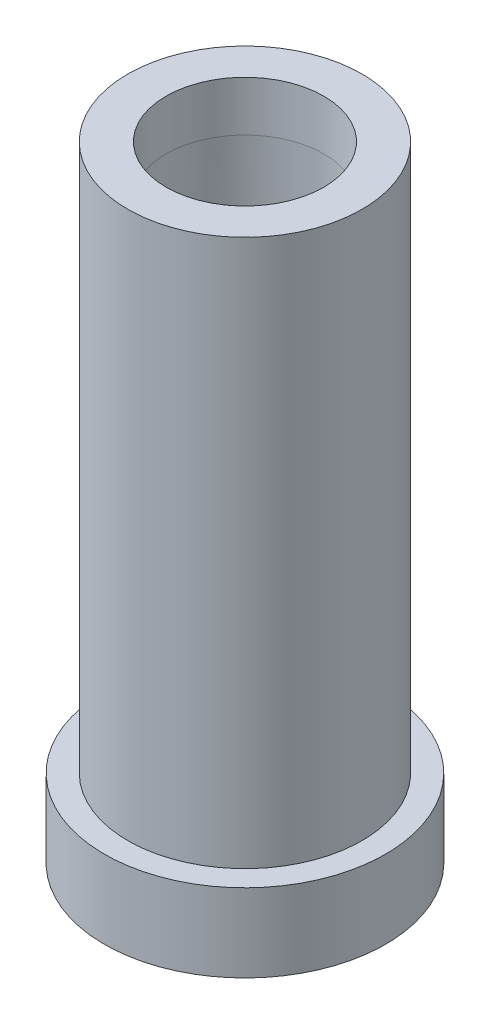
ISO-10303-21;
HEADER;
FILE_DESCRIPTION(('STEP AP214'),'2;1');
FILE_NAME('part.step','',(''),(''),'','','');
FILE_SCHEMA(('AUTOMOTIVE_DESIGN { 1 0 10303 214 1 1 1 1 }'));
ENDSEC;
DATA;
#1=APPLICATION_CONTEXT('core data for automotive mechanical design processes');
#2=APPLICATION_PROTOCOL_DEFINITION('international standard','automotive_design',2000,#1);
#3=PRODUCT_CONTEXT('',#1,'mechanical');
#4=PRODUCT('Part','Part','',(#3));
#5=PRODUCT_RELATED_PRODUCT_CATEGORY('part','',(#4));
#6=PRODUCT_DEFINITION_FORMATION('','',#4);
#7=PRODUCT_DEFINITION_CONTEXT('part definition',#1,'design');
#8=PRODUCT_DEFINITION('design','',#6,#7);
#9=PRODUCT_DEFINITION_SHAPE('','',#8);
#10=(LENGTH_UNIT() NAMED_UNIT(*) SI_UNIT(.MILLI.,.METRE.));
#11=(NAMED_UNIT(*) PLANE_ANGLE_UNIT() SI_UNIT($,.RADIAN.));
#12=(NAMED_UNIT(*) SI_UNIT($,.STERADIAN.) SOLID_ANGLE_UNIT());
#13=UNCERTAINTY_MEASURE_WITH_UNIT(LENGTH_MEASURE(1.E-05),#10,'distance_accuracy_value','');
#14=(GEOMETRIC_REPRESENTATION_CONTEXT(3) GLOBAL_UNCERTAINTY_ASSIGNED_CONTEXT((#13)) GLOBAL_UNIT_ASSIGNED_CONTEXT((#10,
#11,#12)) REPRESENTATION_CONTEXT('',''));
#15=CARTESIAN_POINT('',(0.,0.,0.));
#16=DIRECTION('',(0.,0.,1.));
#17=DIRECTION('',(1.,0.,0.));
#18=AXIS2_PLACEMENT_3D('',#15,#16,#17);
#19=CARTESIAN_POINT('',(0.,-0.001000000000001,0.));
#20=DIRECTION('',(0.,1.,0.));
#21=DIRECTION('',(0.,0.,1.));
#22=AXIS2_PLACEMENT_3D('',#19,#20,#21);
#23=CYLINDRICAL_SURFACE('',#22,5.05);
#24=CARTESIAN_POINT('',(0.,40.,0.));
#25=DIRECTION('',(0.,1.,0.));
#26=DIRECTION('',(0.,0.,1.));
#27=AXIS2_PLACEMENT_3D('',#24,#25,#26);
#28=CIRCLE('',#27,5.05);
#29=CARTESIAN_POINT('',(0.,40.,5.05));
#30=VERTEX_POINT('',#29);
#31=EDGE_CURVE('E63',#30,#30,#28,.T.);
#32=ORIENTED_EDGE('',*,*,#31,.T.);
#33=EDGE_LOOP('',(#32));
#34=FACE_BOUND('',#33,.T.);
#35=CARTESIAN_POINT('',(0.,36.8,0.));
#36=DIRECTION('',(0.,1.,0.));
#37=DIRECTION('',(1.,0.,0.));
#38=AXIS2_PLACEMENT_3D('',#35,#36,#37);
#39=CIRCLE('',#38,5.05);
#40=CARTESIAN_POINT('',(5.05,36.8,0.));
#41=VERTEX_POINT('',#40);
#42=EDGE_CURVE('E59',#41,#41,#39,.T.);
#43=ORIENTED_EDGE('',*,*,#42,.F.);
#44=EDGE_LOOP('',(#43));
#45=FACE_BOUND('',#44,.T.);
#46=ADVANCED_FACE('F41',(#34,#45),#23,.F.);
#47=CARTESIAN_POINT('',(0.,0.,0.));
#48=DIRECTION('',(0.,1.,0.));
#49=DIRECTION('',(-1.,0.,0.));
#50=AXIS2_PLACEMENT_3D('',#47,#48,#49);
#51=PLANE('',#50);
#52=CARTESIAN_POINT('',(0.,0.,0.));
#53=DIRECTION('',(0.,1.,0.));
#54=DIRECTION('',(1.,0.,0.));
#55=AXIS2_PLACEMENT_3D('',#52,#53,#54);
#56=CIRCLE('',#55,6.01364191374583);
#57=CARTESIAN_POINT('',(6.01364191374583,0.,0.));
#58=VERTEX_POINT('',#57);
#59=EDGE_CURVE('E56',#58,#58,#56,.T.);
#60=ORIENTED_EDGE('',*,*,#59,.T.);
#61=EDGE_LOOP('',(#60));
#62=FACE_BOUND('',#61,.T.);
#63=CARTESIAN_POINT('',(0.,0.,0.));
#64=DIRECTION('',(0.,1.,0.));
#65=DIRECTION('',(-1.,0.,0.));
#66=AXIS2_PLACEMENT_3D('',#63,#64,#65);
#67=CIRCLE('',#66,9.00000000000001);
#68=CARTESIAN_POINT('',(-9.00000000000001,0.,0.));
#69=VERTEX_POINT('',#68);
#70=EDGE_CURVE('E11',#69,#69,#67,.T.);
#71=ORIENTED_EDGE('',*,*,#70,.F.);
#72=EDGE_LOOP('',(#71));
#73=FACE_BOUND('',#72,.T.);
#74=ADVANCED_FACE('F43',(#62,#73),#51,.F.);
#75=CARTESIAN_POINT('',(0.,45.,0.));
#76=DIRECTION('',(0.,1.,0.));
#77=DIRECTION('',(-1.,0.,0.));
#78=AXIS2_PLACEMENT_3D('',#75,#76,#77);
#79=CYLINDRICAL_SURFACE('',#78,9.00000000000001);
#80=CARTESIAN_POINT('',(0.,5.,0.));
#81=DIRECTION('',(0.,1.,0.));
#82=DIRECTION('',(-1.,0.,0.));
#83=AXIS2_PLACEMENT_3D('',#80,#81,#82);
#84=CIRCLE('',#83,9.00000000000001);
#85=CARTESIAN_POINT('',(-9.00000000000001,5.,0.));
#86=VERTEX_POINT('',#85);
#87=EDGE_CURVE('E49',#86,#86,#84,.T.);
#88=ORIENTED_EDGE('',*,*,#87,.F.);
#89=EDGE_LOOP('',(#88));
#90=FACE_BOUND('',#89,.T.);
#91=ORIENTED_EDGE('',*,*,#70,.T.);
#92=EDGE_LOOP('',(#91));
#93=FACE_BOUND('',#92,.T.);
#94=ADVANCED_FACE('F80',(#90,#93),#79,.T.);
#95=CARTESIAN_POINT('',(9.00000000000001,5.,0.));
#96=DIRECTION('',(0.,-1.,0.));
#97=DIRECTION('',(1.,0.,0.));
#98=AXIS2_PLACEMENT_3D('',#95,#96,#97);
#99=PLANE('',#98);
#100=CARTESIAN_POINT('',(0.,5.,0.));
#101=DIRECTION('',(0.,1.,0.));
#102=DIRECTION('',(-1.,0.,0.));
#103=AXIS2_PLACEMENT_3D('',#100,#101,#102);
#104=CIRCLE('',#103,7.5);
#105=CARTESIAN_POINT('',(-7.5,5.,0.));
#106=VERTEX_POINT('',#105);
#107=EDGE_CURVE('E73',#106,#106,#104,.T.);
#108=ORIENTED_EDGE('',*,*,#107,.F.);
#109=EDGE_LOOP('',(#108));
#110=FACE_BOUND('',#109,.T.);
#111=ORIENTED_EDGE('',*,*,#87,.T.);
#112=EDGE_LOOP('',(#111));
#113=FACE_BOUND('',#112,.T.);
#114=ADVANCED_FACE('F78',(#110,#113),#99,.F.);
#115=CARTESIAN_POINT('',(0.,45.,0.));
#116=DIRECTION('',(0.,1.,0.));
#117=DIRECTION('',(-1.,0.,0.));
#118=AXIS2_PLACEMENT_3D('',#115,#116,#117);
#119=CYLINDRICAL_SURFACE('',#118,7.5);
#120=CARTESIAN_POINT('',(0.,40.,0.));
#121=DIRECTION('',(0.,1.,0.));
#122=DIRECTION('',(-1.,0.,0.));
#123=AXIS2_PLACEMENT_3D('',#120,#121,#122);
#124=CIRCLE('',#123,7.5);
#125=CARTESIAN_POINT('',(-7.50000000000001,40.,0.));
#126=VERTEX_POINT('',#125);
#127=EDGE_CURVE('E66',#126,#126,#124,.T.);
#128=ORIENTED_EDGE('',*,*,#127,.F.);
#129=EDGE_LOOP('',(#128));
#130=FACE_BOUND('',#129,.T.);
#131=ORIENTED_EDGE('',*,*,#107,.T.);
#132=EDGE_LOOP('',(#131));
#133=FACE_BOUND('',#132,.T.);
#134=ADVANCED_FACE('F100',(#130,#133),#119,.T.);
#135=CARTESIAN_POINT('',(7.5,40.,0.));
#136=DIRECTION('',(0.,-1.,0.));
#137=DIRECTION('',(1.,0.,0.));
#138=AXIS2_PLACEMENT_3D('',#135,#136,#137);
#139=PLANE('',#138);
#140=ORIENTED_EDGE('',*,*,#31,.F.);
#141=EDGE_LOOP('',(#140));
#142=FACE_BOUND('',#141,.T.);
#143=ORIENTED_EDGE('',*,*,#127,.T.);
#144=EDGE_LOOP('',(#143));
#145=FACE_BOUND('',#144,.T.);
#146=ADVANCED_FACE('F98',(#142,#145),#139,.F.);
#147=CARTESIAN_POINT('',(0.,0.,0.));
#148=DIRECTION('',(0.,-1.,0.));
#149=DIRECTION('',(1.,0.,0.));
#150=AXIS2_PLACEMENT_3D('',#147,#148,#149);
#151=CONICAL_SURFACE('',#150,6.01364191374583,0.0261799387799081);
#152=DIRECTION('',(-0.0261769483078663,0.999657324975557,0.));
#153=VECTOR('',#152,1.);
#154=CARTESIAN_POINT('',(5.05,36.8,0.));
#155=LINE('',#154,#153);
#156=EDGE_CURVE('E61',#58,#41,#155,.T.);
#157=ORIENTED_EDGE('',*,*,#156,.F.);
#158=ORIENTED_EDGE('',*,*,#59,.F.);
#159=ORIENTED_EDGE('',*,*,#156,.T.);
#160=ORIENTED_EDGE('',*,*,#42,.T.);
#161=EDGE_LOOP('',(#157,#158,#159,#160));
#162=FACE_BOUND('',#161,.T.);
#163=ADVANCED_FACE('F60',(#162),#151,.F.);
#164=CLOSED_SHELL('',(#46,#74,#94,#114,#134,#146,#163));
#165=MANIFOLD_SOLID_BREP('B2',#164);
#166=ADVANCED_BREP_SHAPE_REPRESENTATION('',(#18,#165),#14);
#167=SHAPE_DEFINITION_REPRESENTATION(#9,#166);
ENDSEC;
END-ISO-10303-21;
